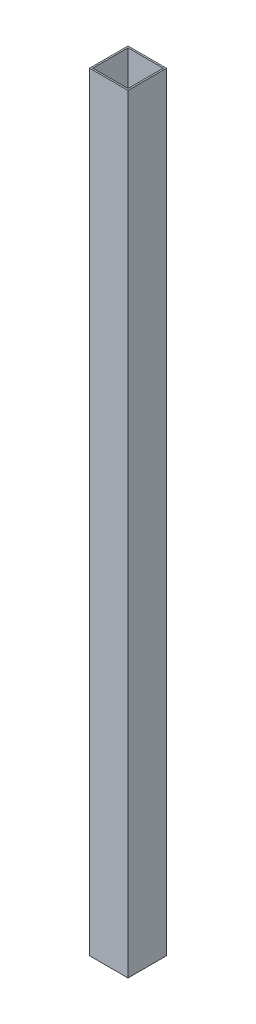
ISO-10303-21;
HEADER;
FILE_DESCRIPTION(('STEP AP214'),'2;1');
FILE_NAME('part.step','',(''),(''),'','','');
FILE_SCHEMA(('AUTOMOTIVE_DESIGN { 1 0 10303 214 1 1 1 1 }'));
ENDSEC;
DATA;
#1=APPLICATION_CONTEXT('core data for automotive mechanical design processes');
#2=APPLICATION_PROTOCOL_DEFINITION('international standard','automotive_design',2000,#1);
#3=PRODUCT_CONTEXT('',#1,'mechanical');
#4=PRODUCT('Part','Part','',(#3));
#5=PRODUCT_RELATED_PRODUCT_CATEGORY('part','',(#4));
#6=PRODUCT_DEFINITION_FORMATION('','',#4);
#7=PRODUCT_DEFINITION_CONTEXT('part definition',#1,'design');
#8=PRODUCT_DEFINITION('design','',#6,#7);
#9=PRODUCT_DEFINITION_SHAPE('','',#8);
#10=(LENGTH_UNIT() NAMED_UNIT(*) SI_UNIT(.MILLI.,.METRE.));
#11=(NAMED_UNIT(*) PLANE_ANGLE_UNIT() SI_UNIT($,.RADIAN.));
#12=(NAMED_UNIT(*) SI_UNIT($,.STERADIAN.) SOLID_ANGLE_UNIT());
#13=UNCERTAINTY_MEASURE_WITH_UNIT(LENGTH_MEASURE(1.E-05),#10,'distance_accuracy_value','');
#14=(GEOMETRIC_REPRESENTATION_CONTEXT(3) GLOBAL_UNCERTAINTY_ASSIGNED_CONTEXT((#13)) GLOBAL_UNIT_ASSIGNED_CONTEXT((#10,
#11,#12)) REPRESENTATION_CONTEXT('',''));
#15=CARTESIAN_POINT('',(0.,0.,0.));
#16=DIRECTION('',(0.,0.,1.));
#17=DIRECTION('',(1.,0.,0.));
#18=AXIS2_PLACEMENT_3D('',#15,#16,#17);
#19=CARTESIAN_POINT('',(0.,1000.,0.));
#20=DIRECTION('',(0.,-1.,0.));
#21=DIRECTION('',(0.,0.,-1.));
#22=AXIS2_PLACEMENT_3D('',#19,#20,#21);
#23=PLANE('',#22);
#24=DIRECTION('',(0.,0.,-1.));
#25=VECTOR('',#24,1.);
#26=CARTESIAN_POINT('',(25.,1000.,25.));
#27=LINE('',#26,#25);
#28=CARTESIAN_POINT('',(25.,1000.,25.));
#29=VERTEX_POINT('',#28);
#30=CARTESIAN_POINT('',(25.,1000.,-25.));
#31=VERTEX_POINT('',#30);
#32=EDGE_CURVE('E153',#29,#31,#27,.T.);
#33=ORIENTED_EDGE('',*,*,#32,.T.);
#34=DIRECTION('',(-1.,0.,0.));
#35=VECTOR('',#34,1.);
#36=CARTESIAN_POINT('',(-25.,1000.,-25.));
#37=LINE('',#36,#35);
#38=CARTESIAN_POINT('',(-25.,1000.,-25.));
#39=VERTEX_POINT('',#38);
#40=EDGE_CURVE('E157',#31,#39,#37,.T.);
#41=ORIENTED_EDGE('',*,*,#40,.T.);
#42=DIRECTION('',(0.,0.,1.));
#43=VECTOR('',#42,1.);
#44=CARTESIAN_POINT('',(-25.,1000.,25.));
#45=LINE('',#44,#43);
#46=CARTESIAN_POINT('',(-25.,1000.,25.));
#47=VERTEX_POINT('',#46);
#48=EDGE_CURVE('E161',#39,#47,#45,.T.);
#49=ORIENTED_EDGE('',*,*,#48,.T.);
#50=DIRECTION('',(1.,0.,0.));
#51=VECTOR('',#50,1.);
#52=CARTESIAN_POINT('',(-25.,1000.,25.));
#53=LINE('',#52,#51);
#54=EDGE_CURVE('E164',#47,#29,#53,.T.);
#55=ORIENTED_EDGE('',*,*,#54,.T.);
#56=EDGE_LOOP('',(#33,#41,#49,#55));
#57=FACE_BOUND('',#56,.T.);
#58=DIRECTION('',(0.,0.,1.));
#59=VECTOR('',#58,1.);
#60=CARTESIAN_POINT('',(-23.,1000.,23.));
#61=LINE('',#60,#59);
#62=CARTESIAN_POINT('',(-23.,1000.,-23.));
#63=VERTEX_POINT('',#62);
#64=CARTESIAN_POINT('',(-23.,1000.,23.));
#65=VERTEX_POINT('',#64);
#66=EDGE_CURVE('E105',#63,#65,#61,.T.);
#67=ORIENTED_EDGE('',*,*,#66,.F.);
#68=DIRECTION('',(-1.,0.,0.));
#69=VECTOR('',#68,1.);
#70=CARTESIAN_POINT('',(-23.,1000.,-23.));
#71=LINE('',#70,#69);
#72=CARTESIAN_POINT('',(23.,1000.,-23.));
#73=VERTEX_POINT('',#72);
#74=EDGE_CURVE('E131',#73,#63,#71,.T.);
#75=ORIENTED_EDGE('',*,*,#74,.F.);
#76=DIRECTION('',(0.,0.,-1.));
#77=VECTOR('',#76,1.);
#78=CARTESIAN_POINT('',(23.,1000.,23.));
#79=LINE('',#78,#77);
#80=CARTESIAN_POINT('',(23.,1000.,23.));
#81=VERTEX_POINT('',#80);
#82=EDGE_CURVE('E127',#81,#73,#79,.T.);
#83=ORIENTED_EDGE('',*,*,#82,.F.);
#84=DIRECTION('',(1.,0.,0.));
#85=VECTOR('',#84,1.);
#86=CARTESIAN_POINT('',(-23.,1000.,23.));
#87=LINE('',#86,#85);
#88=EDGE_CURVE('E114',#65,#81,#87,.T.);
#89=ORIENTED_EDGE('',*,*,#88,.F.);
#90=EDGE_LOOP('',(#67,#75,#83,#89));
#91=FACE_BOUND('',#90,.T.);
#92=ADVANCED_FACE('F39',(#57,#91),#23,.F.);
#93=CARTESIAN_POINT('',(0.,0.,0.));
#94=DIRECTION('',(0.,-1.,0.));
#95=DIRECTION('',(0.,0.,-1.));
#96=AXIS2_PLACEMENT_3D('',#93,#94,#95);
#97=PLANE('',#96);
#98=DIRECTION('',(0.,0.,-1.));
#99=VECTOR('',#98,1.);
#100=CARTESIAN_POINT('',(25.,0.,25.));
#101=LINE('',#100,#99);
#102=CARTESIAN_POINT('',(25.,0.,25.));
#103=VERTEX_POINT('',#102);
#104=CARTESIAN_POINT('',(25.,0.,-25.));
#105=VERTEX_POINT('',#104);
#106=EDGE_CURVE('E123',#103,#105,#101,.T.);
#107=ORIENTED_EDGE('',*,*,#106,.F.);
#108=DIRECTION('',(1.,0.,0.));
#109=VECTOR('',#108,1.);
#110=CARTESIAN_POINT('',(-25.,0.,25.));
#111=LINE('',#110,#109);
#112=CARTESIAN_POINT('',(-25.,0.,25.));
#113=VERTEX_POINT('',#112);
#114=EDGE_CURVE('E158',#113,#103,#111,.T.);
#115=ORIENTED_EDGE('',*,*,#114,.F.);
#116=DIRECTION('',(0.,0.,1.));
#117=VECTOR('',#116,1.);
#118=CARTESIAN_POINT('',(-25.,0.,25.));
#119=LINE('',#118,#117);
#120=CARTESIAN_POINT('',(-25.,0.,-25.));
#121=VERTEX_POINT('',#120);
#122=EDGE_CURVE('E174',#121,#113,#119,.T.);
#123=ORIENTED_EDGE('',*,*,#122,.F.);
#124=DIRECTION('',(-1.,0.,0.));
#125=VECTOR('',#124,1.);
#126=CARTESIAN_POINT('',(-25.,0.,-25.));
#127=LINE('',#126,#125);
#128=EDGE_CURVE('E171',#105,#121,#127,.T.);
#129=ORIENTED_EDGE('',*,*,#128,.F.);
#130=EDGE_LOOP('',(#107,#115,#123,#129));
#131=FACE_BOUND('',#130,.T.);
#132=DIRECTION('',(-1.,0.,0.));
#133=VECTOR('',#132,1.);
#134=CARTESIAN_POINT('',(-23.,0.,-23.));
#135=LINE('',#134,#133);
#136=CARTESIAN_POINT('',(23.,0.,-23.));
#137=VERTEX_POINT('',#136);
#138=CARTESIAN_POINT('',(-23.,0.,-23.));
#139=VERTEX_POINT('',#138);
#140=EDGE_CURVE('E115',#137,#139,#135,.T.);
#141=ORIENTED_EDGE('',*,*,#140,.T.);
#142=DIRECTION('',(0.,0.,1.));
#143=VECTOR('',#142,1.);
#144=CARTESIAN_POINT('',(-23.,0.,23.));
#145=LINE('',#144,#143);
#146=CARTESIAN_POINT('',(-23.,0.,23.));
#147=VERTEX_POINT('',#146);
#148=EDGE_CURVE('E63',#139,#147,#145,.T.);
#149=ORIENTED_EDGE('',*,*,#148,.T.);
#150=DIRECTION('',(1.,0.,0.));
#151=VECTOR('',#150,1.);
#152=CARTESIAN_POINT('',(-23.,0.,23.));
#153=LINE('',#152,#151);
#154=CARTESIAN_POINT('',(23.,0.,23.));
#155=VERTEX_POINT('',#154);
#156=EDGE_CURVE('E121',#147,#155,#153,.T.);
#157=ORIENTED_EDGE('',*,*,#156,.T.);
#158=DIRECTION('',(0.,0.,-1.));
#159=VECTOR('',#158,1.);
#160=CARTESIAN_POINT('',(23.,0.,23.));
#161=LINE('',#160,#159);
#162=EDGE_CURVE('E140',#155,#137,#161,.T.);
#163=ORIENTED_EDGE('',*,*,#162,.T.);
#164=EDGE_LOOP('',(#141,#149,#157,#163));
#165=FACE_BOUND('',#164,.T.);
#166=ADVANCED_FACE('F197',(#131,#165),#97,.T.);
#167=CARTESIAN_POINT('',(25.,1000.,25.));
#168=DIRECTION('',(-1.,0.,0.));
#169=DIRECTION('',(0.,0.,1.));
#170=AXIS2_PLACEMENT_3D('',#167,#168,#169);
#171=PLANE('',#170);
#172=ORIENTED_EDGE('',*,*,#106,.T.);
#173=DIRECTION('',(0.,-1.,0.));
#174=VECTOR('',#173,1.);
#175=CARTESIAN_POINT('',(25.,1000.,-25.));
#176=LINE('',#175,#174);
#177=EDGE_CURVE('E11',#31,#105,#176,.T.);
#178=ORIENTED_EDGE('',*,*,#177,.F.);
#179=ORIENTED_EDGE('',*,*,#32,.F.);
#180=DIRECTION('',(0.,-1.,0.));
#181=VECTOR('',#180,1.);
#182=CARTESIAN_POINT('',(25.,1000.,25.));
#183=LINE('',#182,#181);
#184=EDGE_CURVE('E167',#29,#103,#183,.T.);
#185=ORIENTED_EDGE('',*,*,#184,.T.);
#186=EDGE_LOOP('',(#172,#178,#179,#185));
#187=FACE_BOUND('',#186,.T.);
#188=ADVANCED_FACE('F41',(#187),#171,.F.);
#189=CARTESIAN_POINT('',(-25.,1000.,-25.));
#190=DIRECTION('',(0.,0.,1.));
#191=DIRECTION('',(1.,0.,0.));
#192=AXIS2_PLACEMENT_3D('',#189,#190,#191);
#193=PLANE('',#192);
#194=ORIENTED_EDGE('',*,*,#128,.T.);
#195=DIRECTION('',(0.,-1.,0.));
#196=VECTOR('',#195,1.);
#197=CARTESIAN_POINT('',(-25.,1000.,-25.));
#198=LINE('',#197,#196);
#199=EDGE_CURVE('E48',#39,#121,#198,.T.);
#200=ORIENTED_EDGE('',*,*,#199,.F.);
#201=ORIENTED_EDGE('',*,*,#40,.F.);
#202=ORIENTED_EDGE('',*,*,#177,.T.);
#203=EDGE_LOOP('',(#194,#200,#201,#202));
#204=FACE_BOUND('',#203,.T.);
#205=ADVANCED_FACE('F207',(#204),#193,.F.);
#206=CARTESIAN_POINT('',(-25.,1000.,25.));
#207=DIRECTION('',(1.,0.,0.));
#208=DIRECTION('',(0.,0.,-1.));
#209=AXIS2_PLACEMENT_3D('',#206,#207,#208);
#210=PLANE('',#209);
#211=ORIENTED_EDGE('',*,*,#122,.T.);
#212=DIRECTION('',(0.,-1.,0.));
#213=VECTOR('',#212,1.);
#214=CARTESIAN_POINT('',(-25.,1000.,25.));
#215=LINE('',#214,#213);
#216=EDGE_CURVE('E182',#47,#113,#215,.T.);
#217=ORIENTED_EDGE('',*,*,#216,.F.);
#218=ORIENTED_EDGE('',*,*,#48,.F.);
#219=ORIENTED_EDGE('',*,*,#199,.T.);
#220=EDGE_LOOP('',(#211,#217,#218,#219));
#221=FACE_BOUND('',#220,.T.);
#222=ADVANCED_FACE('F191',(#221),#210,.F.);
#223=CARTESIAN_POINT('',(-25.,1000.,25.));
#224=DIRECTION('',(0.,0.,-1.));
#225=DIRECTION('',(-1.,0.,0.));
#226=AXIS2_PLACEMENT_3D('',#223,#224,#225);
#227=PLANE('',#226);
#228=ORIENTED_EDGE('',*,*,#114,.T.);
#229=ORIENTED_EDGE('',*,*,#184,.F.);
#230=ORIENTED_EDGE('',*,*,#54,.F.);
#231=ORIENTED_EDGE('',*,*,#216,.T.);
#232=EDGE_LOOP('',(#228,#229,#230,#231));
#233=FACE_BOUND('',#232,.T.);
#234=ADVANCED_FACE('F201',(#233),#227,.F.);
#235=CARTESIAN_POINT('',(-23.,1000.,23.));
#236=DIRECTION('',(1.,0.,0.));
#237=DIRECTION('',(0.,0.,-1.));
#238=AXIS2_PLACEMENT_3D('',#235,#236,#237);
#239=PLANE('',#238);
#240=ORIENTED_EDGE('',*,*,#148,.F.);
#241=DIRECTION('',(0.,-1.,0.));
#242=VECTOR('',#241,1.);
#243=CARTESIAN_POINT('',(-23.,1000.,-23.));
#244=LINE('',#243,#242);
#245=EDGE_CURVE('E109',#63,#139,#244,.T.);
#246=ORIENTED_EDGE('',*,*,#245,.F.);
#247=ORIENTED_EDGE('',*,*,#66,.T.);
#248=DIRECTION('',(0.,-1.,0.));
#249=VECTOR('',#248,1.);
#250=CARTESIAN_POINT('',(-23.,1000.,23.));
#251=LINE('',#250,#249);
#252=EDGE_CURVE('E108',#65,#147,#251,.T.);
#253=ORIENTED_EDGE('',*,*,#252,.T.);
#254=EDGE_LOOP('',(#240,#246,#247,#253));
#255=FACE_BOUND('',#254,.T.);
#256=ADVANCED_FACE('F107',(#255),#239,.T.);
#257=CARTESIAN_POINT('',(-23.,1000.,23.));
#258=DIRECTION('',(0.,0.,-1.));
#259=DIRECTION('',(-1.,0.,0.));
#260=AXIS2_PLACEMENT_3D('',#257,#258,#259);
#261=PLANE('',#260);
#262=ORIENTED_EDGE('',*,*,#156,.F.);
#263=ORIENTED_EDGE('',*,*,#252,.F.);
#264=ORIENTED_EDGE('',*,*,#88,.T.);
#265=DIRECTION('',(0.,-1.,0.));
#266=VECTOR('',#265,1.);
#267=CARTESIAN_POINT('',(23.,1000.,23.));
#268=LINE('',#267,#266);
#269=EDGE_CURVE('E124',#81,#155,#268,.T.);
#270=ORIENTED_EDGE('',*,*,#269,.T.);
#271=EDGE_LOOP('',(#262,#263,#264,#270));
#272=FACE_BOUND('',#271,.T.);
#273=ADVANCED_FACE('F118',(#272),#261,.T.);
#274=CARTESIAN_POINT('',(23.,1000.,23.));
#275=DIRECTION('',(-1.,0.,0.));
#276=DIRECTION('',(0.,0.,1.));
#277=AXIS2_PLACEMENT_3D('',#274,#275,#276);
#278=PLANE('',#277);
#279=ORIENTED_EDGE('',*,*,#162,.F.);
#280=ORIENTED_EDGE('',*,*,#269,.F.);
#281=ORIENTED_EDGE('',*,*,#82,.T.);
#282=DIRECTION('',(0.,-1.,0.));
#283=VECTOR('',#282,1.);
#284=CARTESIAN_POINT('',(23.,1000.,-23.));
#285=LINE('',#284,#283);
#286=EDGE_CURVE('E55',#73,#137,#285,.T.);
#287=ORIENTED_EDGE('',*,*,#286,.T.);
#288=EDGE_LOOP('',(#279,#280,#281,#287));
#289=FACE_BOUND('',#288,.T.);
#290=ADVANCED_FACE('F230',(#289),#278,.T.);
#291=CARTESIAN_POINT('',(-23.,1000.,-23.));
#292=DIRECTION('',(0.,0.,1.));
#293=DIRECTION('',(1.,0.,0.));
#294=AXIS2_PLACEMENT_3D('',#291,#292,#293);
#295=PLANE('',#294);
#296=ORIENTED_EDGE('',*,*,#140,.F.);
#297=ORIENTED_EDGE('',*,*,#286,.F.);
#298=ORIENTED_EDGE('',*,*,#74,.T.);
#299=ORIENTED_EDGE('',*,*,#245,.T.);
#300=EDGE_LOOP('',(#296,#297,#298,#299));
#301=FACE_BOUND('',#300,.T.);
#302=ADVANCED_FACE('F234',(#301),#295,.T.);
#303=CLOSED_SHELL('',(#92,#166,#188,#205,#222,#234,#256,#273,#290,#302));
#304=MANIFOLD_SOLID_BREP('B2',#303);
#305=ADVANCED_BREP_SHAPE_REPRESENTATION('',(#18,#304),#14);
#306=SHAPE_DEFINITION_REPRESENTATION(#9,#305);
ENDSEC;
END-ISO-10303-21;
